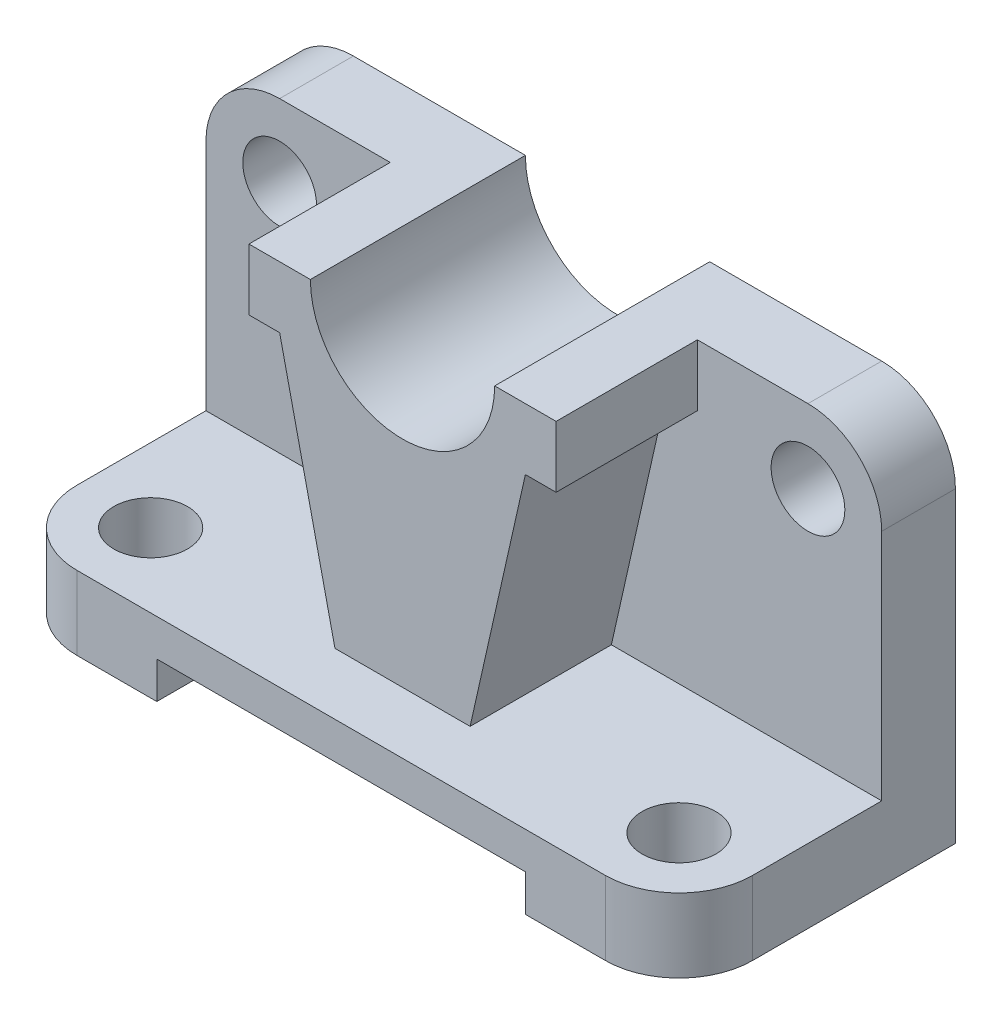
ISO-10303-21;
HEADER;
FILE_DESCRIPTION(('STEP AP214'),'2;1');
FILE_NAME('part.step','',(''),(''),'','','');
FILE_SCHEMA(('AUTOMOTIVE_DESIGN { 1 0 10303 214 1 1 1 1 }'));
ENDSEC;
DATA;
#1=APPLICATION_CONTEXT('core data for automotive mechanical design processes');
#2=APPLICATION_PROTOCOL_DEFINITION('international standard','automotive_design',2000,#1);
#3=PRODUCT_CONTEXT('',#1,'mechanical');
#4=PRODUCT('Part','Part','',(#3));
#5=PRODUCT_RELATED_PRODUCT_CATEGORY('part','',(#4));
#6=PRODUCT_DEFINITION_FORMATION('','',#4);
#7=PRODUCT_DEFINITION_CONTEXT('part definition',#1,'design');
#8=PRODUCT_DEFINITION('design','',#6,#7);
#9=PRODUCT_DEFINITION_SHAPE('','',#8);
#10=(LENGTH_UNIT() NAMED_UNIT(*) SI_UNIT(.MILLI.,.METRE.));
#11=(NAMED_UNIT(*) PLANE_ANGLE_UNIT() SI_UNIT($,.RADIAN.));
#12=(NAMED_UNIT(*) SI_UNIT($,.STERADIAN.) SOLID_ANGLE_UNIT());
#13=UNCERTAINTY_MEASURE_WITH_UNIT(LENGTH_MEASURE(1.E-05),#10,'distance_accuracy_value','');
#14=(GEOMETRIC_REPRESENTATION_CONTEXT(3) GLOBAL_UNCERTAINTY_ASSIGNED_CONTEXT((#13)) GLOBAL_UNIT_ASSIGNED_CONTEXT((#10,
#11,#12)) REPRESENTATION_CONTEXT('',''));
#15=CARTESIAN_POINT('',(0.,0.,0.));
#16=DIRECTION('',(0.,0.,1.));
#17=DIRECTION('',(1.,0.,0.));
#18=AXIS2_PLACEMENT_3D('',#15,#16,#17);
#19=CARTESIAN_POINT('',(0.,0.,45.));
#20=DIRECTION('',(0.,-1.,0.));
#21=DIRECTION('',(0.,0.,-1.));
#22=AXIS2_PLACEMENT_3D('',#19,#20,#21);
#23=PLANE('',#22);
#24=CARTESIAN_POINT('',(-43.,0.,33.));
#25=DIRECTION('',(0.,-1.,0.));
#26=DIRECTION('',(0.,0.,-1.));
#27=AXIS2_PLACEMENT_3D('',#24,#25,#26);
#28=CIRCLE('',#27,5.99999999999999);
#29=CARTESIAN_POINT('',(-43.,0.,39.));
#30=VERTEX_POINT('',#29);
#31=EDGE_CURVE('E952',#30,#30,#28,.T.);
#32=ORIENTED_EDGE('',*,*,#31,.T.);
#33=EDGE_LOOP('',(#32));
#34=FACE_BOUND('',#33,.T.);
#35=CARTESIAN_POINT('',(43.,0.,33.));
#36=DIRECTION('',(0.,-1.,0.));
#37=DIRECTION('',(0.,0.,-1.));
#38=AXIS2_PLACEMENT_3D('',#35,#36,#37);
#39=CIRCLE('',#38,5.99999999999999);
#40=CARTESIAN_POINT('',(43.,0.,39.));
#41=VERTEX_POINT('',#40);
#42=EDGE_CURVE('E491',#41,#41,#39,.T.);
#43=ORIENTED_EDGE('',*,*,#42,.T.);
#44=EDGE_LOOP('',(#43));
#45=FACE_BOUND('',#44,.T.);
#46=DIRECTION('',(-1.,0.,0.));
#47=VECTOR('',#46,1.);
#48=CARTESIAN_POINT('',(0.,0.,45.));
#49=LINE('',#48,#47);
#50=CARTESIAN_POINT('',(43.,0.,45.));
#51=VERTEX_POINT('',#50);
#52=CARTESIAN_POINT('',(-43.,0.,45.));
#53=VERTEX_POINT('',#52);
#54=EDGE_CURVE('E254',#51,#53,#49,.T.);
#55=ORIENTED_EDGE('',*,*,#54,.F.);
#56=CARTESIAN_POINT('',(43.,0.,33.));
#57=DIRECTION('',(0.,-1.,0.));
#58=DIRECTION('',(0.,0.,-1.));
#59=AXIS2_PLACEMENT_3D('',#56,#57,#58);
#60=CIRCLE('',#59,12.);
#61=CARTESIAN_POINT('',(55.,0.,33.));
#62=VERTEX_POINT('',#61);
#63=EDGE_CURVE('E337',#51,#62,#60,.F.);
#64=ORIENTED_EDGE('',*,*,#63,.T.);
#65=DIRECTION('',(0.,0.,-1.));
#66=VECTOR('',#65,1.);
#67=CARTESIAN_POINT('',(55.,0.,45.));
#68=LINE('',#67,#66);
#69=CARTESIAN_POINT('',(55.,0.,12.));
#70=VERTEX_POINT('',#69);
#71=EDGE_CURVE('E308',#62,#70,#68,.T.);
#72=ORIENTED_EDGE('',*,*,#71,.T.);
#73=DIRECTION('',(-1.,0.,0.));
#74=VECTOR('',#73,1.);
#75=CARTESIAN_POINT('',(0.,0.,12.));
#76=LINE('',#75,#74);
#77=CARTESIAN_POINT('',(11.,0.,12.));
#78=VERTEX_POINT('',#77);
#79=EDGE_CURVE('E461',#70,#78,#76,.T.);
#80=ORIENTED_EDGE('',*,*,#79,.T.);
#81=DIRECTION('',(0.,0.,-1.));
#82=VECTOR('',#81,1.);
#83=CARTESIAN_POINT('',(11.,0.,35.));
#84=LINE('',#83,#82);
#85=CARTESIAN_POINT('',(11.,0.,35.));
#86=VERTEX_POINT('',#85);
#87=EDGE_CURVE('E406',#86,#78,#84,.T.);
#88=ORIENTED_EDGE('',*,*,#87,.F.);
#89=DIRECTION('',(-1.,0.,0.));
#90=VECTOR('',#89,1.);
#91=CARTESIAN_POINT('',(0.,0.,35.));
#92=LINE('',#91,#90);
#93=CARTESIAN_POINT('',(-11.,0.,35.));
#94=VERTEX_POINT('',#93);
#95=EDGE_CURVE('E418',#86,#94,#92,.T.);
#96=ORIENTED_EDGE('',*,*,#95,.T.);
#97=DIRECTION('',(0.,0.,-1.));
#98=VECTOR('',#97,1.);
#99=CARTESIAN_POINT('',(-11.,0.,35.));
#100=LINE('',#99,#98);
#101=CARTESIAN_POINT('',(-11.,0.,12.));
#102=VERTEX_POINT('',#101);
#103=EDGE_CURVE('E238',#94,#102,#100,.T.);
#104=ORIENTED_EDGE('',*,*,#103,.T.);
#105=DIRECTION('',(-1.,0.,0.));
#106=VECTOR('',#105,1.);
#107=CARTESIAN_POINT('',(0.,0.,12.));
#108=LINE('',#107,#106);
#109=CARTESIAN_POINT('',(-55.,0.,12.));
#110=VERTEX_POINT('',#109);
#111=EDGE_CURVE('E416',#102,#110,#108,.T.);
#112=ORIENTED_EDGE('',*,*,#111,.T.);
#113=DIRECTION('',(0.,0.,-1.));
#114=VECTOR('',#113,1.);
#115=CARTESIAN_POINT('',(-55.,0.,45.));
#116=LINE('',#115,#114);
#117=CARTESIAN_POINT('',(-55.,0.,33.));
#118=VERTEX_POINT('',#117);
#119=EDGE_CURVE('E305',#118,#110,#116,.T.);
#120=ORIENTED_EDGE('',*,*,#119,.F.);
#121=CARTESIAN_POINT('',(-43.,0.,33.));
#122=DIRECTION('',(0.,-1.,0.));
#123=DIRECTION('',(0.,0.,-1.));
#124=AXIS2_PLACEMENT_3D('',#121,#122,#123);
#125=CIRCLE('',#124,12.);
#126=EDGE_CURVE('E334',#118,#53,#125,.F.);
#127=ORIENTED_EDGE('',*,*,#126,.T.);
#128=EDGE_LOOP('',(#55,#64,#72,#80,#88,#96,#104,#112,#120,#127));
#129=FACE_BOUND('',#128,.T.);
#130=ADVANCED_FACE('F43',(#34,#45,#129),#23,.F.);
#131=CARTESIAN_POINT('',(30.,0.,45.));
#132=DIRECTION('',(-1.,0.,0.));
#133=DIRECTION('',(0.,0.,1.));
#134=AXIS2_PLACEMENT_3D('',#131,#132,#133);
#135=PLANE('',#134);
#136=DIRECTION('',(0.,1.,0.));
#137=VECTOR('',#136,1.);
#138=CARTESIAN_POINT('',(30.,0.,0.));
#139=LINE('',#138,#137);
#140=CARTESIAN_POINT('',(30.,-12.,0.));
#141=VERTEX_POINT('',#140);
#142=CARTESIAN_POINT('',(30.,-5.99999999999999,0.));
#143=VERTEX_POINT('',#142);
#144=EDGE_CURVE('E245',#141,#143,#139,.T.);
#145=ORIENTED_EDGE('',*,*,#144,.F.);
#146=DIRECTION('',(0.,0.,-1.));
#147=VECTOR('',#146,1.);
#148=CARTESIAN_POINT('',(30.,-12.,45.));
#149=LINE('',#148,#147);
#150=CARTESIAN_POINT('',(30.,-12.,45.));
#151=VERTEX_POINT('',#150);
#152=EDGE_CURVE('E314',#151,#141,#149,.T.);
#153=ORIENTED_EDGE('',*,*,#152,.F.);
#154=DIRECTION('',(0.,1.,0.));
#155=VECTOR('',#154,1.);
#156=CARTESIAN_POINT('',(30.,0.,45.));
#157=LINE('',#156,#155);
#158=CARTESIAN_POINT('',(30.,-5.99999999999999,45.));
#159=VERTEX_POINT('',#158);
#160=EDGE_CURVE('E246',#151,#159,#157,.T.);
#161=ORIENTED_EDGE('',*,*,#160,.T.);
#162=DIRECTION('',(0.,0.,-1.));
#163=VECTOR('',#162,1.);
#164=CARTESIAN_POINT('',(30.,-5.99999999999999,45.));
#165=LINE('',#164,#163);
#166=EDGE_CURVE('E267',#159,#143,#165,.T.);
#167=ORIENTED_EDGE('',*,*,#166,.T.);
#168=EDGE_LOOP('',(#145,#153,#161,#167));
#169=FACE_BOUND('',#168,.T.);
#170=ADVANCED_FACE('F530',(#169),#135,.T.);
#171=CARTESIAN_POINT('',(0.,-12.,45.));
#172=DIRECTION('',(0.,-1.,0.));
#173=DIRECTION('',(1.,0.,0.));
#174=AXIS2_PLACEMENT_3D('',#171,#172,#173);
#175=PLANE('',#174);
#176=CARTESIAN_POINT('',(43.,-12.,33.));
#177=DIRECTION('',(0.,1.,0.));
#178=DIRECTION('',(0.,0.,-1.));
#179=AXIS2_PLACEMENT_3D('',#176,#177,#178);
#180=CIRCLE('',#179,5.99999999999999);
#181=CARTESIAN_POINT('',(43.,-12.,39.));
#182=VERTEX_POINT('',#181);
#183=EDGE_CURVE('E953',#182,#182,#180,.T.);
#184=ORIENTED_EDGE('',*,*,#183,.T.);
#185=EDGE_LOOP('',(#184));
#186=FACE_BOUND('',#185,.T.);
#187=DIRECTION('',(0.,0.,-1.));
#188=VECTOR('',#187,1.);
#189=CARTESIAN_POINT('',(55.,-12.,45.));
#190=LINE('',#189,#188);
#191=CARTESIAN_POINT('',(55.,-12.,33.));
#192=VERTEX_POINT('',#191);
#193=CARTESIAN_POINT('',(55.,-12.,0.));
#194=VERTEX_POINT('',#193);
#195=EDGE_CURVE('E311',#192,#194,#190,.T.);
#196=ORIENTED_EDGE('',*,*,#195,.F.);
#197=CARTESIAN_POINT('',(43.,-12.,33.));
#198=DIRECTION('',(0.,-1.,0.));
#199=DIRECTION('',(1.,0.,0.));
#200=AXIS2_PLACEMENT_3D('',#197,#198,#199);
#201=CIRCLE('',#200,12.);
#202=CARTESIAN_POINT('',(43.,-12.,45.));
#203=VERTEX_POINT('',#202);
#204=EDGE_CURVE('E324',#192,#203,#201,.T.);
#205=ORIENTED_EDGE('',*,*,#204,.T.);
#206=DIRECTION('',(-1.,0.,0.));
#207=VECTOR('',#206,1.);
#208=CARTESIAN_POINT('',(0.,-12.,45.));
#209=LINE('',#208,#207);
#210=EDGE_CURVE('E250',#203,#151,#209,.T.);
#211=ORIENTED_EDGE('',*,*,#210,.T.);
#212=ORIENTED_EDGE('',*,*,#152,.T.);
#213=DIRECTION('',(-1.,0.,0.));
#214=VECTOR('',#213,1.);
#215=CARTESIAN_POINT('',(0.,-12.,0.));
#216=LINE('',#215,#214);
#217=EDGE_CURVE('E271',#194,#141,#216,.T.);
#218=ORIENTED_EDGE('',*,*,#217,.F.);
#219=EDGE_LOOP('',(#196,#205,#211,#212,#218));
#220=FACE_BOUND('',#219,.T.);
#221=ADVANCED_FACE('F536',(#186,#220),#175,.T.);
#222=CARTESIAN_POINT('',(55.,0.,45.));
#223=DIRECTION('',(1.,0.,0.));
#224=DIRECTION('',(0.,0.,-1.));
#225=AXIS2_PLACEMENT_3D('',#222,#223,#224);
#226=PLANE('',#225);
#227=ORIENTED_EDGE('',*,*,#71,.F.);
#228=DIRECTION('',(0.,-1.,0.));
#229=VECTOR('',#228,1.);
#230=CARTESIAN_POINT('',(55.,0.,33.));
#231=LINE('',#230,#229);
#232=EDGE_CURVE('E320',#62,#192,#231,.T.);
#233=ORIENTED_EDGE('',*,*,#232,.T.);
#234=ORIENTED_EDGE('',*,*,#195,.T.);
#235=DIRECTION('',(0.,-1.,0.));
#236=VECTOR('',#235,1.);
#237=CARTESIAN_POINT('',(55.,0.,0.));
#238=LINE('',#237,#236);
#239=CARTESIAN_POINT('',(55.,38.,0.));
#240=VERTEX_POINT('',#239);
#241=EDGE_CURVE('E275',#240,#194,#238,.T.);
#242=ORIENTED_EDGE('',*,*,#241,.F.);
#243=DIRECTION('',(0.,0.,-1.));
#244=VECTOR('',#243,1.);
#245=CARTESIAN_POINT('',(55.,38.,45.));
#246=LINE('',#245,#244);
#247=CARTESIAN_POINT('',(55.,38.,12.));
#248=VERTEX_POINT('',#247);
#249=EDGE_CURVE('E317',#240,#248,#246,.F.);
#250=ORIENTED_EDGE('',*,*,#249,.T.);
#251=DIRECTION('',(0.,-1.,0.));
#252=VECTOR('',#251,1.);
#253=CARTESIAN_POINT('',(55.,0.,12.));
#254=LINE('',#253,#252);
#255=EDGE_CURVE('E455',#248,#70,#254,.T.);
#256=ORIENTED_EDGE('',*,*,#255,.T.);
#257=EDGE_LOOP('',(#227,#233,#234,#242,#250,#256));
#258=FACE_BOUND('',#257,.T.);
#259=ADVANCED_FACE('F545',(#258),#226,.T.);
#260=CARTESIAN_POINT('',(-55.,0.,45.));
#261=DIRECTION('',(1.,0.,0.));
#262=DIRECTION('',(0.,1.,0.));
#263=AXIS2_PLACEMENT_3D('',#260,#261,#262);
#264=PLANE('',#263);
#265=DIRECTION('',(0.,0.,-1.));
#266=VECTOR('',#265,1.);
#267=CARTESIAN_POINT('',(-55.,-12.,45.));
#268=LINE('',#267,#266);
#269=CARTESIAN_POINT('',(-55.,-12.,33.));
#270=VERTEX_POINT('',#269);
#271=CARTESIAN_POINT('',(-55.,-12.,0.));
#272=VERTEX_POINT('',#271);
#273=EDGE_CURVE('E301',#270,#272,#268,.T.);
#274=ORIENTED_EDGE('',*,*,#273,.F.);
#275=DIRECTION('',(0.,-1.,0.));
#276=VECTOR('',#275,1.);
#277=CARTESIAN_POINT('',(-55.,0.,33.));
#278=LINE('',#277,#276);
#279=EDGE_CURVE('E347',#270,#118,#278,.F.);
#280=ORIENTED_EDGE('',*,*,#279,.T.);
#281=ORIENTED_EDGE('',*,*,#119,.T.);
#282=DIRECTION('',(0.,1.,0.));
#283=VECTOR('',#282,1.);
#284=CARTESIAN_POINT('',(-55.,0.,12.));
#285=LINE('',#284,#283);
#286=CARTESIAN_POINT('',(-55.,38.,12.));
#287=VERTEX_POINT('',#286);
#288=EDGE_CURVE('E477',#110,#287,#285,.T.);
#289=ORIENTED_EDGE('',*,*,#288,.T.);
#290=DIRECTION('',(0.,0.,-1.));
#291=VECTOR('',#290,1.);
#292=CARTESIAN_POINT('',(-55.,38.,0.));
#293=LINE('',#292,#291);
#294=CARTESIAN_POINT('',(-55.,38.,0.));
#295=VERTEX_POINT('',#294);
#296=EDGE_CURVE('E343',#287,#295,#293,.T.);
#297=ORIENTED_EDGE('',*,*,#296,.T.);
#298=DIRECTION('',(0.,-1.,0.));
#299=VECTOR('',#298,1.);
#300=CARTESIAN_POINT('',(-55.,0.,0.));
#301=LINE('',#300,#299);
#302=EDGE_CURVE('E279',#295,#272,#301,.T.);
#303=ORIENTED_EDGE('',*,*,#302,.T.);
#304=EDGE_LOOP('',(#274,#280,#281,#289,#297,#303));
#305=FACE_BOUND('',#304,.T.);
#306=ADVANCED_FACE('F543',(#305),#264,.F.);
#307=CARTESIAN_POINT('',(0.,-12.,45.));
#308=DIRECTION('',(0.,1.,0.));
#309=DIRECTION('',(-1.,0.,0.));
#310=AXIS2_PLACEMENT_3D('',#307,#308,#309);
#311=PLANE('',#310);
#312=CARTESIAN_POINT('',(-43.,-12.,33.));
#313=DIRECTION('',(0.,1.,0.));
#314=DIRECTION('',(0.,0.,1.));
#315=AXIS2_PLACEMENT_3D('',#312,#313,#314);
#316=CIRCLE('',#315,5.99999999999999);
#317=CARTESIAN_POINT('',(-43.,-12.,39.));
#318=VERTEX_POINT('',#317);
#319=EDGE_CURVE('E950',#318,#318,#316,.T.);
#320=ORIENTED_EDGE('',*,*,#319,.T.);
#321=EDGE_LOOP('',(#320));
#322=FACE_BOUND('',#321,.T.);
#323=DIRECTION('',(1.,0.,0.));
#324=VECTOR('',#323,1.);
#325=CARTESIAN_POINT('',(0.,-12.,45.));
#326=LINE('',#325,#324);
#327=CARTESIAN_POINT('',(-43.,-12.,45.));
#328=VERTEX_POINT('',#327);
#329=CARTESIAN_POINT('',(-30.,-12.,45.));
#330=VERTEX_POINT('',#329);
#331=EDGE_CURVE('E258',#328,#330,#326,.T.);
#332=ORIENTED_EDGE('',*,*,#331,.F.);
#333=CARTESIAN_POINT('',(-43.,-12.,33.));
#334=DIRECTION('',(0.,1.,0.));
#335=DIRECTION('',(-1.,0.,0.));
#336=AXIS2_PLACEMENT_3D('',#333,#334,#335);
#337=CIRCLE('',#336,12.);
#338=EDGE_CURVE('E340',#328,#270,#337,.F.);
#339=ORIENTED_EDGE('',*,*,#338,.T.);
#340=ORIENTED_EDGE('',*,*,#273,.T.);
#341=DIRECTION('',(1.,0.,0.));
#342=VECTOR('',#341,1.);
#343=CARTESIAN_POINT('',(0.,-12.,0.));
#344=LINE('',#343,#342);
#345=CARTESIAN_POINT('',(-30.,-12.,0.));
#346=VERTEX_POINT('',#345);
#347=EDGE_CURVE('E282',#272,#346,#344,.T.);
#348=ORIENTED_EDGE('',*,*,#347,.T.);
#349=DIRECTION('',(0.,0.,-1.));
#350=VECTOR('',#349,1.);
#351=CARTESIAN_POINT('',(-30.,-12.,45.));
#352=LINE('',#351,#350);
#353=EDGE_CURVE('E297',#330,#346,#352,.T.);
#354=ORIENTED_EDGE('',*,*,#353,.F.);
#355=EDGE_LOOP('',(#332,#339,#340,#348,#354));
#356=FACE_BOUND('',#355,.T.);
#357=ADVANCED_FACE('F578',(#322,#356),#311,.F.);
#358=CARTESIAN_POINT('',(-30.,0.,45.));
#359=DIRECTION('',(-1.,0.,0.));
#360=DIRECTION('',(0.,0.,1.));
#361=AXIS2_PLACEMENT_3D('',#358,#359,#360);
#362=PLANE('',#361);
#363=DIRECTION('',(0.,1.,0.));
#364=VECTOR('',#363,1.);
#365=CARTESIAN_POINT('',(-30.,0.,0.));
#366=LINE('',#365,#364);
#367=CARTESIAN_POINT('',(-30.,-6.,0.));
#368=VERTEX_POINT('',#367);
#369=EDGE_CURVE('E285',#346,#368,#366,.T.);
#370=ORIENTED_EDGE('',*,*,#369,.T.);
#371=DIRECTION('',(0.,0.,-1.));
#372=VECTOR('',#371,1.);
#373=CARTESIAN_POINT('',(-30.,-6.,45.));
#374=LINE('',#373,#372);
#375=CARTESIAN_POINT('',(-30.,-6.,45.));
#376=VERTEX_POINT('',#375);
#377=EDGE_CURVE('E293',#376,#368,#374,.T.);
#378=ORIENTED_EDGE('',*,*,#377,.F.);
#379=DIRECTION('',(0.,1.,0.));
#380=VECTOR('',#379,1.);
#381=CARTESIAN_POINT('',(-30.,0.,45.));
#382=LINE('',#381,#380);
#383=EDGE_CURVE('E261',#330,#376,#382,.T.);
#384=ORIENTED_EDGE('',*,*,#383,.F.);
#385=ORIENTED_EDGE('',*,*,#353,.T.);
#386=EDGE_LOOP('',(#370,#378,#384,#385));
#387=FACE_BOUND('',#386,.T.);
#388=ADVANCED_FACE('F584',(#387),#362,.F.);
#389=CARTESIAN_POINT('',(0.,-5.99999999999999,45.));
#390=DIRECTION('',(0.,1.,0.));
#391=DIRECTION('',(-1.,0.,0.));
#392=AXIS2_PLACEMENT_3D('',#389,#390,#391);
#393=PLANE('',#392);
#394=DIRECTION('',(1.,0.,0.));
#395=VECTOR('',#394,1.);
#396=CARTESIAN_POINT('',(0.,-5.99999999999999,0.));
#397=LINE('',#396,#395);
#398=EDGE_CURVE('E251',#368,#143,#397,.T.);
#399=ORIENTED_EDGE('',*,*,#398,.T.);
#400=ORIENTED_EDGE('',*,*,#166,.F.);
#401=DIRECTION('',(1.,0.,0.));
#402=VECTOR('',#401,1.);
#403=CARTESIAN_POINT('',(0.,-5.99999999999999,45.));
#404=LINE('',#403,#402);
#405=EDGE_CURVE('E264',#376,#159,#404,.T.);
#406=ORIENTED_EDGE('',*,*,#405,.F.);
#407=ORIENTED_EDGE('',*,*,#377,.T.);
#408=EDGE_LOOP('',(#399,#400,#406,#407));
#409=FACE_BOUND('',#408,.T.);
#410=ADVANCED_FACE('F589',(#409),#393,.F.);
#411=CARTESIAN_POINT('',(0.,0.,45.));
#412=DIRECTION('',(0.,0.,1.));
#413=DIRECTION('',(1.,0.,0.));
#414=AXIS2_PLACEMENT_3D('',#411,#412,#413);
#415=PLANE('',#414);
#416=ORIENTED_EDGE('',*,*,#210,.F.);
#417=DIRECTION('',(0.,-1.,0.));
#418=VECTOR('',#417,1.);
#419=CARTESIAN_POINT('',(43.,0.,45.));
#420=LINE('',#419,#418);
#421=EDGE_CURVE('E331',#203,#51,#420,.F.);
#422=ORIENTED_EDGE('',*,*,#421,.T.);
#423=ORIENTED_EDGE('',*,*,#54,.T.);
#424=DIRECTION('',(0.,-1.,0.));
#425=VECTOR('',#424,1.);
#426=CARTESIAN_POINT('',(-43.,-12.,45.));
#427=LINE('',#426,#425);
#428=EDGE_CURVE('E327',#53,#328,#427,.T.);
#429=ORIENTED_EDGE('',*,*,#428,.T.);
#430=ORIENTED_EDGE('',*,*,#331,.T.);
#431=ORIENTED_EDGE('',*,*,#383,.T.);
#432=ORIENTED_EDGE('',*,*,#405,.T.);
#433=ORIENTED_EDGE('',*,*,#160,.F.);
#434=EDGE_LOOP('',(#416,#422,#423,#429,#430,#431,#432,#433));
#435=FACE_BOUND('',#434,.T.);
#436=ADVANCED_FACE('F526',(#435),#415,.T.);
#437=CARTESIAN_POINT('',(0.,0.,0.));
#438=DIRECTION('',(0.,0.,1.));
#439=DIRECTION('',(1.,0.,0.));
#440=AXIS2_PLACEMENT_3D('',#437,#438,#439);
#441=PLANE('',#440);
#442=ORIENTED_EDGE('',*,*,#302,.F.);
#443=CARTESIAN_POINT('',(-43.,38.,0.));
#444=DIRECTION('',(0.,0.,1.));
#445=DIRECTION('',(1.,0.,0.));
#446=AXIS2_PLACEMENT_3D('',#443,#444,#445);
#447=CIRCLE('',#446,12.);
#448=CARTESIAN_POINT('',(-43.,50.,0.));
#449=VERTEX_POINT('',#448);
#450=EDGE_CURVE('E353',#295,#449,#447,.F.);
#451=ORIENTED_EDGE('',*,*,#450,.T.);
#452=DIRECTION('',(1.,0.,0.));
#453=VECTOR('',#452,1.);
#454=CARTESIAN_POINT('',(0.,50.,0.));
#455=LINE('',#454,#453);
#456=CARTESIAN_POINT('',(-15.,50.,0.));
#457=VERTEX_POINT('',#456);
#458=EDGE_CURVE('E381',#449,#457,#455,.T.);
#459=ORIENTED_EDGE('',*,*,#458,.T.);
#460=CARTESIAN_POINT('',(0.,50.,0.));
#461=DIRECTION('',(0.,0.,1.));
#462=DIRECTION('',(1.,0.,0.));
#463=AXIS2_PLACEMENT_3D('',#460,#461,#462);
#464=CIRCLE('',#463,15.);
#465=CARTESIAN_POINT('',(15.,50.,0.));
#466=VERTEX_POINT('',#465);
#467=EDGE_CURVE('E378',#457,#466,#464,.T.);
#468=ORIENTED_EDGE('',*,*,#467,.T.);
#469=DIRECTION('',(1.,0.,0.));
#470=VECTOR('',#469,1.);
#471=CARTESIAN_POINT('',(0.,50.,0.));
#472=LINE('',#471,#470);
#473=CARTESIAN_POINT('',(43.,50.,0.));
#474=VERTEX_POINT('',#473);
#475=EDGE_CURVE('E367',#466,#474,#472,.T.);
#476=ORIENTED_EDGE('',*,*,#475,.T.);
#477=CARTESIAN_POINT('',(43.,38.,0.));
#478=DIRECTION('',(0.,0.,1.));
#479=DIRECTION('',(1.,0.,0.));
#480=AXIS2_PLACEMENT_3D('',#477,#478,#479);
#481=CIRCLE('',#480,12.);
#482=EDGE_CURVE('E350',#474,#240,#481,.F.);
#483=ORIENTED_EDGE('',*,*,#482,.T.);
#484=ORIENTED_EDGE('',*,*,#241,.T.);
#485=ORIENTED_EDGE('',*,*,#217,.T.);
#486=ORIENTED_EDGE('',*,*,#144,.T.);
#487=ORIENTED_EDGE('',*,*,#398,.F.);
#488=ORIENTED_EDGE('',*,*,#369,.F.);
#489=ORIENTED_EDGE('',*,*,#347,.F.);
#490=EDGE_LOOP('',(#442,#451,#459,#468,#476,#483,#484,#485,#486,#487,#488,#489));
#491=FACE_BOUND('',#490,.T.);
#492=CARTESIAN_POINT('',(43.,38.,0.));
#493=DIRECTION('',(0.,0.,1.));
#494=DIRECTION('',(1.,0.,0.));
#495=AXIS2_PLACEMENT_3D('',#492,#493,#494);
#496=CIRCLE('',#495,6.);
#497=CARTESIAN_POINT('',(49.,38.,0.));
#498=VERTEX_POINT('',#497);
#499=EDGE_CURVE('E465',#498,#498,#496,.F.);
#500=ORIENTED_EDGE('',*,*,#499,.F.);
#501=EDGE_LOOP('',(#500));
#502=FACE_BOUND('',#501,.T.);
#503=CARTESIAN_POINT('',(-43.,38.,0.));
#504=DIRECTION('',(0.,0.,1.));
#505=DIRECTION('',(1.,0.,0.));
#506=AXIS2_PLACEMENT_3D('',#503,#504,#505);
#507=CIRCLE('',#506,6.);
#508=CARTESIAN_POINT('',(-37.,38.,0.));
#509=VERTEX_POINT('',#508);
#510=EDGE_CURVE('E487',#509,#509,#507,.T.);
#511=ORIENTED_EDGE('',*,*,#510,.T.);
#512=EDGE_LOOP('',(#511));
#513=FACE_BOUND('',#512,.T.);
#514=ADVANCED_FACE('F374',(#491,#502,#513),#441,.F.);
#515=CARTESIAN_POINT('',(0.,50.,35.));
#516=DIRECTION('',(0.,0.,-1.));
#517=DIRECTION('',(-1.,0.,0.));
#518=AXIS2_PLACEMENT_3D('',#515,#516,#517);
#519=CYLINDRICAL_SURFACE('',#518,15.);
#520=ORIENTED_EDGE('',*,*,#467,.F.);
#521=DIRECTION('',(0.,0.,-1.));
#522=VECTOR('',#521,1.);
#523=CARTESIAN_POINT('',(-15.,50.,35.));
#524=LINE('',#523,#522);
#525=CARTESIAN_POINT('',(-15.,50.,35.));
#526=VERTEX_POINT('',#525);
#527=EDGE_CURVE('E236',#526,#457,#524,.T.);
#528=ORIENTED_EDGE('',*,*,#527,.F.);
#529=CARTESIAN_POINT('',(0.,50.,35.));
#530=DIRECTION('',(0.,0.,1.));
#531=DIRECTION('',(1.,0.,0.));
#532=AXIS2_PLACEMENT_3D('',#529,#530,#531);
#533=CIRCLE('',#532,15.);
#534=CARTESIAN_POINT('',(15.,50.,35.));
#535=VERTEX_POINT('',#534);
#536=EDGE_CURVE('E380',#526,#535,#533,.T.);
#537=ORIENTED_EDGE('',*,*,#536,.T.);
#538=DIRECTION('',(0.,0.,-1.));
#539=VECTOR('',#538,1.);
#540=CARTESIAN_POINT('',(15.,50.,35.));
#541=LINE('',#540,#539);
#542=EDGE_CURVE('E391',#535,#466,#541,.T.);
#543=ORIENTED_EDGE('',*,*,#542,.T.);
#544=EDGE_LOOP('',(#520,#528,#537,#543));
#545=FACE_BOUND('',#544,.T.);
#546=ADVANCED_FACE('F518',(#545),#519,.F.);
#547=CARTESIAN_POINT('',(0.,50.,35.));
#548=DIRECTION('',(0.,1.,0.));
#549=DIRECTION('',(-1.,0.,0.));
#550=AXIS2_PLACEMENT_3D('',#547,#548,#549);
#551=PLANE('',#550);
#552=ORIENTED_EDGE('',*,*,#458,.F.);
#553=DIRECTION('',(0.,0.,-1.));
#554=VECTOR('',#553,1.);
#555=CARTESIAN_POINT('',(-43.,50.,12.));
#556=LINE('',#555,#554);
#557=CARTESIAN_POINT('',(-43.,50.,12.));
#558=VERTEX_POINT('',#557);
#559=EDGE_CURVE('E65',#449,#558,#556,.F.);
#560=ORIENTED_EDGE('',*,*,#559,.T.);
#561=DIRECTION('',(1.,0.,0.));
#562=VECTOR('',#561,1.);
#563=CARTESIAN_POINT('',(0.,50.,12.));
#564=LINE('',#563,#562);
#565=CARTESIAN_POINT('',(-25.,50.,12.));
#566=VERTEX_POINT('',#565);
#567=EDGE_CURVE('E225',#558,#566,#564,.T.);
#568=ORIENTED_EDGE('',*,*,#567,.T.);
#569=DIRECTION('',(0.,0.,-1.));
#570=VECTOR('',#569,1.);
#571=CARTESIAN_POINT('',(-25.,50.,35.));
#572=LINE('',#571,#570);
#573=CARTESIAN_POINT('',(-25.,50.,35.));
#574=VERTEX_POINT('',#573);
#575=EDGE_CURVE('E223',#574,#566,#572,.T.);
#576=ORIENTED_EDGE('',*,*,#575,.F.);
#577=DIRECTION('',(1.,0.,0.));
#578=VECTOR('',#577,1.);
#579=CARTESIAN_POINT('',(0.,50.,35.));
#580=LINE('',#579,#578);
#581=EDGE_CURVE('E386',#574,#526,#580,.T.);
#582=ORIENTED_EDGE('',*,*,#581,.T.);
#583=ORIENTED_EDGE('',*,*,#527,.T.);
#584=EDGE_LOOP('',(#552,#560,#568,#576,#582,#583));
#585=FACE_BOUND('',#584,.T.);
#586=ADVANCED_FACE('F474',(#585),#551,.T.);
#587=CARTESIAN_POINT('',(-25.,0.,35.));
#588=DIRECTION('',(-1.,0.,0.));
#589=DIRECTION('',(0.,0.,1.));
#590=AXIS2_PLACEMENT_3D('',#587,#588,#589);
#591=PLANE('',#590);
#592=DIRECTION('',(0.,1.,0.));
#593=VECTOR('',#592,1.);
#594=CARTESIAN_POINT('',(-25.,0.,12.));
#595=LINE('',#594,#593);
#596=CARTESIAN_POINT('',(-25.,40.,12.));
#597=VERTEX_POINT('',#596);
#598=EDGE_CURVE('E208',#597,#566,#595,.T.);
#599=ORIENTED_EDGE('',*,*,#598,.F.);
#600=DIRECTION('',(0.,0.,-1.));
#601=VECTOR('',#600,1.);
#602=CARTESIAN_POINT('',(-25.,40.,35.));
#603=LINE('',#602,#601);
#604=CARTESIAN_POINT('',(-25.,40.,35.));
#605=VERTEX_POINT('',#604);
#606=EDGE_CURVE('E221',#605,#597,#603,.T.);
#607=ORIENTED_EDGE('',*,*,#606,.F.);
#608=DIRECTION('',(0.,1.,0.));
#609=VECTOR('',#608,1.);
#610=CARTESIAN_POINT('',(-25.,0.,35.));
#611=LINE('',#610,#609);
#612=EDGE_CURVE('E435',#605,#574,#611,.T.);
#613=ORIENTED_EDGE('',*,*,#612,.T.);
#614=ORIENTED_EDGE('',*,*,#575,.T.);
#615=EDGE_LOOP('',(#599,#607,#613,#614));
#616=FACE_BOUND('',#615,.T.);
#617=ADVANCED_FACE('F219',(#616),#591,.T.);
#618=CARTESIAN_POINT('',(0.,40.,35.));
#619=DIRECTION('',(0.,-1.,0.));
#620=DIRECTION('',(0.,0.,-1.));
#621=AXIS2_PLACEMENT_3D('',#618,#619,#620);
#622=PLANE('',#621);
#623=DIRECTION('',(-1.,0.,0.));
#624=VECTOR('',#623,1.);
#625=CARTESIAN_POINT('',(0.,40.,12.));
#626=LINE('',#625,#624);
#627=CARTESIAN_POINT('',(-20.,40.,12.));
#628=VERTEX_POINT('',#627);
#629=EDGE_CURVE('E205',#628,#597,#626,.T.);
#630=ORIENTED_EDGE('',*,*,#629,.F.);
#631=DIRECTION('',(0.,0.,-1.));
#632=VECTOR('',#631,1.);
#633=CARTESIAN_POINT('',(-20.,40.,35.));
#634=LINE('',#633,#632);
#635=CARTESIAN_POINT('',(-20.,40.,35.));
#636=VERTEX_POINT('',#635);
#637=EDGE_CURVE('E232',#636,#628,#634,.T.);
#638=ORIENTED_EDGE('',*,*,#637,.F.);
#639=DIRECTION('',(-1.,0.,0.));
#640=VECTOR('',#639,1.);
#641=CARTESIAN_POINT('',(0.,40.,35.));
#642=LINE('',#641,#640);
#643=EDGE_CURVE('E230',#636,#605,#642,.T.);
#644=ORIENTED_EDGE('',*,*,#643,.T.);
#645=ORIENTED_EDGE('',*,*,#606,.T.);
#646=EDGE_LOOP('',(#630,#638,#644,#645));
#647=FACE_BOUND('',#646,.T.);
#648=ADVANCED_FACE('F228',(#647),#622,.T.);
#649=CARTESIAN_POINT('',(-10.4699583581202,-2.35574063057704,35.));
#650=DIRECTION('',(-0.975609756097561,-0.219512195121951,0.));
#651=DIRECTION('',(0.219512195121951,-0.975609756097561,0.));
#652=AXIS2_PLACEMENT_3D('',#649,#650,#651);
#653=PLANE('',#652);
#654=DIRECTION('',(-0.219512195121951,0.975609756097561,0.));
#655=VECTOR('',#654,1.);
#656=CARTESIAN_POINT('',(-10.4699583581202,-2.35574063057704,12.));
#657=LINE('',#656,#655);
#658=EDGE_CURVE('E211',#102,#628,#657,.T.);
#659=ORIENTED_EDGE('',*,*,#658,.F.);
#660=ORIENTED_EDGE('',*,*,#103,.F.);
#661=DIRECTION('',(-0.219512195121951,0.975609756097561,0.));
#662=VECTOR('',#661,1.);
#663=CARTESIAN_POINT('',(-10.4699583581202,-2.35574063057704,35.));
#664=LINE('',#663,#662);
#665=EDGE_CURVE('E423',#94,#636,#664,.T.);
#666=ORIENTED_EDGE('',*,*,#665,.T.);
#667=ORIENTED_EDGE('',*,*,#637,.T.);
#668=EDGE_LOOP('',(#659,#660,#666,#667));
#669=FACE_BOUND('',#668,.T.);
#670=ADVANCED_FACE('F422',(#669),#653,.T.);
#671=CARTESIAN_POINT('',(10.4699583581202,-2.35574063057704,35.));
#672=DIRECTION('',(0.975609756097561,-0.219512195121951,0.));
#673=DIRECTION('',(0.219512195121951,0.975609756097561,0.));
#674=AXIS2_PLACEMENT_3D('',#671,#672,#673);
#675=PLANE('',#674);
#676=DIRECTION('',(-0.219512195121951,-0.975609756097561,0.));
#677=VECTOR('',#676,1.);
#678=CARTESIAN_POINT('',(10.4699583581202,-2.35574063057704,12.));
#679=LINE('',#678,#677);
#680=CARTESIAN_POINT('',(20.,40.,12.));
#681=VERTEX_POINT('',#680);
#682=EDGE_CURVE('E500',#681,#78,#679,.T.);
#683=ORIENTED_EDGE('',*,*,#682,.F.);
#684=DIRECTION('',(0.,0.,-1.));
#685=VECTOR('',#684,1.);
#686=CARTESIAN_POINT('',(20.,40.,35.));
#687=LINE('',#686,#685);
#688=CARTESIAN_POINT('',(20.,40.,35.));
#689=VERTEX_POINT('',#688);
#690=EDGE_CURVE('E402',#689,#681,#687,.T.);
#691=ORIENTED_EDGE('',*,*,#690,.F.);
#692=DIRECTION('',(-0.219512195121951,-0.975609756097561,0.));
#693=VECTOR('',#692,1.);
#694=CARTESIAN_POINT('',(10.4699583581202,-2.35574063057704,35.));
#695=LINE('',#694,#693);
#696=EDGE_CURVE('E433',#689,#86,#695,.T.);
#697=ORIENTED_EDGE('',*,*,#696,.T.);
#698=ORIENTED_EDGE('',*,*,#87,.T.);
#699=EDGE_LOOP('',(#683,#691,#697,#698));
#700=FACE_BOUND('',#699,.T.);
#701=ADVANCED_FACE('F508',(#700),#675,.T.);
#702=CARTESIAN_POINT('',(0.,40.,35.));
#703=DIRECTION('',(0.,-1.,0.));
#704=DIRECTION('',(0.,0.,-1.));
#705=AXIS2_PLACEMENT_3D('',#702,#703,#704);
#706=PLANE('',#705);
#707=DIRECTION('',(-1.,0.,0.));
#708=VECTOR('',#707,1.);
#709=CARTESIAN_POINT('',(0.,40.,12.));
#710=LINE('',#709,#708);
#711=CARTESIAN_POINT('',(25.,40.,12.));
#712=VERTEX_POINT('',#711);
#713=EDGE_CURVE('E497',#712,#681,#710,.T.);
#714=ORIENTED_EDGE('',*,*,#713,.F.);
#715=DIRECTION('',(0.,0.,-1.));
#716=VECTOR('',#715,1.);
#717=CARTESIAN_POINT('',(25.,40.,35.));
#718=LINE('',#717,#716);
#719=CARTESIAN_POINT('',(25.,40.,35.));
#720=VERTEX_POINT('',#719);
#721=EDGE_CURVE('E398',#720,#712,#718,.T.);
#722=ORIENTED_EDGE('',*,*,#721,.F.);
#723=DIRECTION('',(-1.,0.,0.));
#724=VECTOR('',#723,1.);
#725=CARTESIAN_POINT('',(0.,40.,35.));
#726=LINE('',#725,#724);
#727=EDGE_CURVE('E441',#720,#689,#726,.T.);
#728=ORIENTED_EDGE('',*,*,#727,.T.);
#729=ORIENTED_EDGE('',*,*,#690,.T.);
#730=EDGE_LOOP('',(#714,#722,#728,#729));
#731=FACE_BOUND('',#730,.T.);
#732=ADVANCED_FACE('F513',(#731),#706,.T.);
#733=CARTESIAN_POINT('',(25.,0.,35.));
#734=DIRECTION('',(1.,0.,0.));
#735=DIRECTION('',(0.,0.,-1.));
#736=AXIS2_PLACEMENT_3D('',#733,#734,#735);
#737=PLANE('',#736);
#738=DIRECTION('',(0.,-1.,0.));
#739=VECTOR('',#738,1.);
#740=CARTESIAN_POINT('',(25.,0.,12.));
#741=LINE('',#740,#739);
#742=CARTESIAN_POINT('',(25.,50.,12.));
#743=VERTEX_POINT('',#742);
#744=EDGE_CURVE('E494',#743,#712,#741,.T.);
#745=ORIENTED_EDGE('',*,*,#744,.F.);
#746=DIRECTION('',(0.,0.,-1.));
#747=VECTOR('',#746,1.);
#748=CARTESIAN_POINT('',(25.,50.,35.));
#749=LINE('',#748,#747);
#750=CARTESIAN_POINT('',(25.,50.,35.));
#751=VERTEX_POINT('',#750);
#752=EDGE_CURVE('E394',#751,#743,#749,.T.);
#753=ORIENTED_EDGE('',*,*,#752,.F.);
#754=DIRECTION('',(0.,-1.,0.));
#755=VECTOR('',#754,1.);
#756=CARTESIAN_POINT('',(25.,0.,35.));
#757=LINE('',#756,#755);
#758=EDGE_CURVE('E445',#751,#720,#757,.T.);
#759=ORIENTED_EDGE('',*,*,#758,.T.);
#760=ORIENTED_EDGE('',*,*,#721,.T.);
#761=EDGE_LOOP('',(#745,#753,#759,#760));
#762=FACE_BOUND('',#761,.T.);
#763=ADVANCED_FACE('F516',(#762),#737,.T.);
#764=CARTESIAN_POINT('',(0.,50.,35.));
#765=DIRECTION('',(0.,1.,0.));
#766=DIRECTION('',(0.,0.,1.));
#767=AXIS2_PLACEMENT_3D('',#764,#765,#766);
#768=PLANE('',#767);
#769=DIRECTION('',(1.,0.,0.));
#770=VECTOR('',#769,1.);
#771=CARTESIAN_POINT('',(0.,50.,12.));
#772=LINE('',#771,#770);
#773=CARTESIAN_POINT('',(43.,50.,12.));
#774=VERTEX_POINT('',#773);
#775=EDGE_CURVE('E369',#743,#774,#772,.T.);
#776=ORIENTED_EDGE('',*,*,#775,.T.);
#777=DIRECTION('',(0.,0.,-1.));
#778=VECTOR('',#777,1.);
#779=CARTESIAN_POINT('',(43.,50.,35.));
#780=LINE('',#779,#778);
#781=EDGE_CURVE('E52',#774,#474,#780,.T.);
#782=ORIENTED_EDGE('',*,*,#781,.T.);
#783=ORIENTED_EDGE('',*,*,#475,.F.);
#784=ORIENTED_EDGE('',*,*,#542,.F.);
#785=DIRECTION('',(1.,0.,0.));
#786=VECTOR('',#785,1.);
#787=CARTESIAN_POINT('',(0.,50.,35.));
#788=LINE('',#787,#786);
#789=EDGE_CURVE('E395',#535,#751,#788,.T.);
#790=ORIENTED_EDGE('',*,*,#789,.T.);
#791=ORIENTED_EDGE('',*,*,#752,.T.);
#792=EDGE_LOOP('',(#776,#782,#783,#784,#790,#791));
#793=FACE_BOUND('',#792,.T.);
#794=ADVANCED_FACE('F366',(#793),#768,.T.);
#795=CARTESIAN_POINT('',(0.,0.,35.));
#796=DIRECTION('',(0.,0.,1.));
#797=DIRECTION('',(1.,0.,0.));
#798=AXIS2_PLACEMENT_3D('',#795,#796,#797);
#799=PLANE('',#798);
#800=ORIENTED_EDGE('',*,*,#536,.F.);
#801=ORIENTED_EDGE('',*,*,#581,.F.);
#802=ORIENTED_EDGE('',*,*,#612,.F.);
#803=ORIENTED_EDGE('',*,*,#643,.F.);
#804=ORIENTED_EDGE('',*,*,#665,.F.);
#805=ORIENTED_EDGE('',*,*,#95,.F.);
#806=ORIENTED_EDGE('',*,*,#696,.F.);
#807=ORIENTED_EDGE('',*,*,#727,.F.);
#808=ORIENTED_EDGE('',*,*,#758,.F.);
#809=ORIENTED_EDGE('',*,*,#789,.F.);
#810=EDGE_LOOP('',(#800,#801,#802,#803,#804,#805,#806,#807,#808,#809));
#811=FACE_BOUND('',#810,.T.);
#812=ADVANCED_FACE('F426',(#811),#799,.T.);
#813=CARTESIAN_POINT('',(43.,38.,12.));
#814=DIRECTION('',(0.,0.,-1.));
#815=DIRECTION('',(-1.,0.,0.));
#816=AXIS2_PLACEMENT_3D('',#813,#814,#815);
#817=CYLINDRICAL_SURFACE('',#816,6.);
#818=CARTESIAN_POINT('',(43.,38.,12.));
#819=DIRECTION('',(0.,0.,1.));
#820=DIRECTION('',(1.,0.,0.));
#821=AXIS2_PLACEMENT_3D('',#818,#819,#820);
#822=CIRCLE('',#821,6.);
#823=CARTESIAN_POINT('',(49.,38.,12.));
#824=VERTEX_POINT('',#823);
#825=EDGE_CURVE('E452',#824,#824,#822,.F.);
#826=ORIENTED_EDGE('',*,*,#825,.F.);
#827=EDGE_LOOP('',(#826));
#828=FACE_BOUND('',#827,.T.);
#829=ORIENTED_EDGE('',*,*,#499,.T.);
#830=EDGE_LOOP('',(#829));
#831=FACE_BOUND('',#830,.T.);
#832=ADVANCED_FACE('F603',(#828,#831),#817,.F.);
#833=CARTESIAN_POINT('',(0.,0.,12.));
#834=DIRECTION('',(0.,0.,1.));
#835=DIRECTION('',(1.,0.,0.));
#836=AXIS2_PLACEMENT_3D('',#833,#834,#835);
#837=PLANE('',#836);
#838=ORIENTED_EDGE('',*,*,#255,.F.);
#839=CARTESIAN_POINT('',(43.,38.,12.));
#840=DIRECTION('',(0.,0.,1.));
#841=DIRECTION('',(1.,0.,0.));
#842=AXIS2_PLACEMENT_3D('',#839,#840,#841);
#843=CIRCLE('',#842,12.);
#844=EDGE_CURVE('E11',#248,#774,#843,.T.);
#845=ORIENTED_EDGE('',*,*,#844,.T.);
#846=ORIENTED_EDGE('',*,*,#775,.F.);
#847=ORIENTED_EDGE('',*,*,#744,.T.);
#848=ORIENTED_EDGE('',*,*,#713,.T.);
#849=ORIENTED_EDGE('',*,*,#682,.T.);
#850=ORIENTED_EDGE('',*,*,#79,.F.);
#851=EDGE_LOOP('',(#838,#845,#846,#847,#848,#849,#850));
#852=FACE_BOUND('',#851,.T.);
#853=ORIENTED_EDGE('',*,*,#825,.T.);
#854=EDGE_LOOP('',(#853));
#855=FACE_BOUND('',#854,.T.);
#856=ADVANCED_FACE('F600',(#852,#855),#837,.T.);
#857=CARTESIAN_POINT('',(-43.,38.,12.));
#858=DIRECTION('',(0.,0.,-1.));
#859=DIRECTION('',(-1.,0.,0.));
#860=AXIS2_PLACEMENT_3D('',#857,#858,#859);
#861=CYLINDRICAL_SURFACE('',#860,6.);
#862=CARTESIAN_POINT('',(-43.,38.,12.));
#863=DIRECTION('',(0.,0.,1.));
#864=DIRECTION('',(1.,0.,0.));
#865=AXIS2_PLACEMENT_3D('',#862,#863,#864);
#866=CIRCLE('',#865,6.);
#867=CARTESIAN_POINT('',(-37.,38.,12.));
#868=VERTEX_POINT('',#867);
#869=EDGE_CURVE('E216',#868,#868,#866,.T.);
#870=ORIENTED_EDGE('',*,*,#869,.T.);
#871=EDGE_LOOP('',(#870));
#872=FACE_BOUND('',#871,.T.);
#873=ORIENTED_EDGE('',*,*,#510,.F.);
#874=EDGE_LOOP('',(#873));
#875=FACE_BOUND('',#874,.T.);
#876=ADVANCED_FACE('F602',(#872,#875),#861,.F.);
#877=CARTESIAN_POINT('',(0.,0.,12.));
#878=DIRECTION('',(0.,0.,1.));
#879=DIRECTION('',(1.,0.,0.));
#880=AXIS2_PLACEMENT_3D('',#877,#878,#879);
#881=PLANE('',#880);
#882=ORIENTED_EDGE('',*,*,#869,.F.);
#883=EDGE_LOOP('',(#882));
#884=FACE_BOUND('',#883,.T.);
#885=ORIENTED_EDGE('',*,*,#567,.F.);
#886=CARTESIAN_POINT('',(-43.,38.,12.));
#887=DIRECTION('',(0.,0.,1.));
#888=DIRECTION('',(1.,0.,0.));
#889=AXIS2_PLACEMENT_3D('',#886,#887,#888);
#890=CIRCLE('',#889,12.);
#891=EDGE_CURVE('E358',#558,#287,#890,.T.);
#892=ORIENTED_EDGE('',*,*,#891,.T.);
#893=ORIENTED_EDGE('',*,*,#288,.F.);
#894=ORIENTED_EDGE('',*,*,#111,.F.);
#895=ORIENTED_EDGE('',*,*,#658,.T.);
#896=ORIENTED_EDGE('',*,*,#629,.T.);
#897=ORIENTED_EDGE('',*,*,#598,.T.);
#898=EDGE_LOOP('',(#885,#892,#893,#894,#895,#896,#897));
#899=FACE_BOUND('',#898,.T.);
#900=ADVANCED_FACE('F207',(#884,#899),#881,.T.);
#901=CARTESIAN_POINT('',(43.,0.,33.));
#902=DIRECTION('',(0.,-1.,0.));
#903=DIRECTION('',(0.,0.,-1.));
#904=AXIS2_PLACEMENT_3D('',#901,#902,#903);
#905=CYLINDRICAL_SURFACE('',#904,12.);
#906=ORIENTED_EDGE('',*,*,#63,.F.);
#907=ORIENTED_EDGE('',*,*,#421,.F.);
#908=ORIENTED_EDGE('',*,*,#204,.F.);
#909=ORIENTED_EDGE('',*,*,#232,.F.);
#910=EDGE_LOOP('',(#906,#907,#908,#909));
#911=FACE_BOUND('',#910,.T.);
#912=ADVANCED_FACE('F552',(#911),#905,.T.);
#913=CARTESIAN_POINT('',(-43.,0.,33.));
#914=DIRECTION('',(0.,1.,0.));
#915=DIRECTION('',(-1.,0.,0.));
#916=AXIS2_PLACEMENT_3D('',#913,#914,#915);
#917=CYLINDRICAL_SURFACE('',#916,12.);
#918=ORIENTED_EDGE('',*,*,#126,.F.);
#919=ORIENTED_EDGE('',*,*,#279,.F.);
#920=ORIENTED_EDGE('',*,*,#338,.F.);
#921=ORIENTED_EDGE('',*,*,#428,.F.);
#922=EDGE_LOOP('',(#918,#919,#920,#921));
#923=FACE_BOUND('',#922,.T.);
#924=ADVANCED_FACE('F555',(#923),#917,.T.);
#925=CARTESIAN_POINT('',(-43.,38.,45.));
#926=DIRECTION('',(0.,0.,1.));
#927=DIRECTION('',(1.,0.,0.));
#928=AXIS2_PLACEMENT_3D('',#925,#926,#927);
#929=CYLINDRICAL_SURFACE('',#928,12.);
#930=ORIENTED_EDGE('',*,*,#891,.F.);
#931=ORIENTED_EDGE('',*,*,#559,.F.);
#932=ORIENTED_EDGE('',*,*,#450,.F.);
#933=ORIENTED_EDGE('',*,*,#296,.F.);
#934=EDGE_LOOP('',(#930,#931,#932,#933));
#935=FACE_BOUND('',#934,.T.);
#936=ADVANCED_FACE('F558',(#935),#929,.T.);
#937=CARTESIAN_POINT('',(43.,38.,35.));
#938=DIRECTION('',(0.,0.,-1.));
#939=DIRECTION('',(-1.,0.,0.));
#940=AXIS2_PLACEMENT_3D('',#937,#938,#939);
#941=CYLINDRICAL_SURFACE('',#940,12.);
#942=ORIENTED_EDGE('',*,*,#844,.F.);
#943=ORIENTED_EDGE('',*,*,#249,.F.);
#944=ORIENTED_EDGE('',*,*,#482,.F.);
#945=ORIENTED_EDGE('',*,*,#781,.F.);
#946=EDGE_LOOP('',(#942,#943,#944,#945));
#947=FACE_BOUND('',#946,.T.);
#948=ADVANCED_FACE('F45',(#947),#941,.T.);
#949=CARTESIAN_POINT('',(-43.,-12.,33.));
#950=DIRECTION('',(0.,1.,0.));
#951=DIRECTION('',(0.,0.,1.));
#952=AXIS2_PLACEMENT_3D('',#949,#950,#951);
#953=CYLINDRICAL_SURFACE('',#952,5.99999999999999);
#954=CARTESIAN_POINT('',(-43.,-12.,39.));
#955=CARTESIAN_POINT('',(-43.,-11.875,39.));
#956=CARTESIAN_POINT('',(-43.,-11.75,39.));
#957=CARTESIAN_POINT('',(-43.,-11.5,39.));
#958=CARTESIAN_POINT('',(-43.,-11.375,39.));
#959=CARTESIAN_POINT('',(-43.,-11.125,39.));
#960=CARTESIAN_POINT('',(-43.,-11.,39.));
#961=CARTESIAN_POINT('',(-43.,-10.75,39.));
#962=CARTESIAN_POINT('',(-43.,-10.625,39.));
#963=CARTESIAN_POINT('',(-43.,-10.375,39.));
#964=CARTESIAN_POINT('',(-43.,-10.25,39.));
#965=CARTESIAN_POINT('',(-43.,-10.,39.));
#966=CARTESIAN_POINT('',(-43.,-9.87500000000001,39.));
#967=CARTESIAN_POINT('',(-43.,-9.62500000000001,39.));
#968=CARTESIAN_POINT('',(-43.,-9.50000000000001,39.));
#969=CARTESIAN_POINT('',(-43.,-9.25000000000001,39.));
#970=CARTESIAN_POINT('',(-43.,-9.12500000000001,39.));
#971=CARTESIAN_POINT('',(-43.,-8.87500000000001,39.));
#972=CARTESIAN_POINT('',(-43.,-8.75000000000001,39.));
#973=CARTESIAN_POINT('',(-43.,-8.50000000000001,39.));
#974=CARTESIAN_POINT('',(-43.,-8.37500000000001,39.));
#975=CARTESIAN_POINT('',(-43.,-8.12500000000001,39.));
#976=CARTESIAN_POINT('',(-43.,-8.00000000000001,39.));
#977=CARTESIAN_POINT('',(-43.,-7.75000000000001,39.));
#978=CARTESIAN_POINT('',(-43.,-7.62500000000001,39.));
#979=CARTESIAN_POINT('',(-43.,-7.37500000000001,39.));
#980=CARTESIAN_POINT('',(-43.,-7.25000000000001,39.));
#981=CARTESIAN_POINT('',(-43.,-7.00000000000001,39.));
#982=CARTESIAN_POINT('',(-43.,-6.87500000000001,39.));
#983=CARTESIAN_POINT('',(-43.,-6.62500000000001,39.));
#984=CARTESIAN_POINT('',(-43.,-6.50000000000001,39.));
#985=CARTESIAN_POINT('',(-43.,-6.25000000000001,39.));
#986=CARTESIAN_POINT('',(-43.,-6.12500000000001,39.));
#987=CARTESIAN_POINT('',(-43.,-5.87500000000001,39.));
#988=CARTESIAN_POINT('',(-43.,-5.75000000000001,39.));
#989=CARTESIAN_POINT('',(-43.,-5.50000000000001,39.));
#990=CARTESIAN_POINT('',(-43.,-5.375,39.));
#991=CARTESIAN_POINT('',(-43.,-5.125,39.));
#992=CARTESIAN_POINT('',(-43.,-5.,39.));
#993=CARTESIAN_POINT('',(-43.,-4.75,39.));
#994=CARTESIAN_POINT('',(-43.,-4.625,39.));
#995=CARTESIAN_POINT('',(-43.,-4.375,39.));
#996=CARTESIAN_POINT('',(-43.,-4.25,39.));
#997=CARTESIAN_POINT('',(-43.,-4.00000000000001,39.));
#998=CARTESIAN_POINT('',(-43.,-3.87500000000001,39.));
#999=CARTESIAN_POINT('',(-43.,-3.625,39.));
#1000=CARTESIAN_POINT('',(-43.,-3.5,39.));
#1001=CARTESIAN_POINT('',(-43.,-3.25,39.));
#1002=CARTESIAN_POINT('',(-43.,-3.125,39.));
#1003=CARTESIAN_POINT('',(-43.,-2.875,39.));
#1004=CARTESIAN_POINT('',(-43.,-2.75,39.));
#1005=CARTESIAN_POINT('',(-43.,-2.5,39.));
#1006=CARTESIAN_POINT('',(-43.,-2.375,39.));
#1007=CARTESIAN_POINT('',(-43.,-2.125,39.));
#1008=CARTESIAN_POINT('',(-43.,-2.,39.));
#1009=CARTESIAN_POINT('',(-43.,-1.75,39.));
#1010=CARTESIAN_POINT('',(-43.,-1.625,39.));
#1011=CARTESIAN_POINT('',(-43.,-1.375,39.));
#1012=CARTESIAN_POINT('',(-43.,-1.25,39.));
#1013=CARTESIAN_POINT('',(-43.,-0.999999999999999,39.));
#1014=CARTESIAN_POINT('',(-43.,-0.874999999999999,39.));
#1015=CARTESIAN_POINT('',(-43.,-0.624999999999999,39.));
#1016=CARTESIAN_POINT('',(-43.,-0.499999999999999,39.));
#1017=CARTESIAN_POINT('',(-43.,-0.249999999999999,39.));
#1018=CARTESIAN_POINT('',(-43.,-0.124999999999998,39.));
#1019=CARTESIAN_POINT('',(-43.,0.,39.));
#1020=B_SPLINE_CURVE_WITH_KNOTS('',3,(#954,#955,#956,#957,#958,#959,#960,#961,#962,#963,#964,
#965,#966,#967,#968,#969,#970,#971,#972,#973,#974,#975,#976,#977,#978,#979,#980,#981,#982,#983,
#984,#985,#986,#987,#988,#989,#990,#991,#992,#993,#994,#995,#996,#997,#998,#999,#1000,#1001,
#1002,#1003,#1004,#1005,#1006,#1007,#1008,#1009,#1010,#1011,#1012,#1013,#1014,#1015,#1016,#1017,
#1018,#1019),.UNSPECIFIED.,.F.,.F.,(4,2,2,2,2,2,2,2,2,2,2,2,2,2,2,2,2,2,2,2,2,2,2,2,2,2,2,2,2,2,
2,2,4),(0.,0.375000000000002,0.750000000000002,1.125,1.5,1.875,2.25,2.625,3.,3.37500000000001,
3.75000000000001,4.12500000000001,4.50000000000001,4.87500000000001,5.25000000000001,
5.62500000000001,6.00000000000001,6.37500000000001,6.75000000000001,7.12500000000001,
7.50000000000001,7.87500000000001,8.25000000000001,8.62500000000001,9.00000000000001,
9.37500000000001,9.75000000000001,10.125,10.5,10.875,11.25,11.625,12.),.UNSPECIFIED.);
#1021=EDGE_CURVE('BSEAM565',#318,#30,#1020,.T.);
#1022=ORIENTED_EDGE('',*,*,#319,.F.);
#1023=ORIENTED_EDGE('',*,*,#31,.F.);
#1024=ORIENTED_EDGE('',*,*,#1021,.T.);
#1025=ORIENTED_EDGE('',*,*,#1021,.F.);
#1026=EDGE_LOOP('',(#1022,#1024,#1023,#1025));
#1027=FACE_BOUND('',#1026,.T.);
#1028=ADVANCED_FACE('F565',(#1027),#953,.F.);
#1029=CARTESIAN_POINT('',(43.,-12.,33.));
#1030=DIRECTION('',(0.,1.,0.));
#1031=DIRECTION('',(0.,0.,1.));
#1032=AXIS2_PLACEMENT_3D('',#1029,#1030,#1031);
#1033=CYLINDRICAL_SURFACE('',#1032,5.99999999999999);
#1034=CARTESIAN_POINT('',(43.,-12.,39.));
#1035=CARTESIAN_POINT('',(43.,-11.875,39.));
#1036=CARTESIAN_POINT('',(43.,-11.75,39.));
#1037=CARTESIAN_POINT('',(43.,-11.5,39.));
#1038=CARTESIAN_POINT('',(43.,-11.375,39.));
#1039=CARTESIAN_POINT('',(43.,-11.125,39.));
#1040=CARTESIAN_POINT('',(43.,-11.,39.));
#1041=CARTESIAN_POINT('',(43.,-10.75,39.));
#1042=CARTESIAN_POINT('',(43.,-10.625,39.));
#1043=CARTESIAN_POINT('',(43.,-10.375,39.));
#1044=CARTESIAN_POINT('',(43.,-10.25,39.));
#1045=CARTESIAN_POINT('',(43.,-10.,39.));
#1046=CARTESIAN_POINT('',(43.,-9.87500000000001,39.));
#1047=CARTESIAN_POINT('',(43.,-9.62500000000001,39.));
#1048=CARTESIAN_POINT('',(43.,-9.50000000000001,39.));
#1049=CARTESIAN_POINT('',(43.,-9.25000000000001,39.));
#1050=CARTESIAN_POINT('',(43.,-9.12500000000001,39.));
#1051=CARTESIAN_POINT('',(43.,-8.87500000000001,39.));
#1052=CARTESIAN_POINT('',(43.,-8.75000000000001,39.));
#1053=CARTESIAN_POINT('',(43.,-8.50000000000001,39.));
#1054=CARTESIAN_POINT('',(43.,-8.37500000000001,39.));
#1055=CARTESIAN_POINT('',(43.,-8.12500000000001,39.));
#1056=CARTESIAN_POINT('',(43.,-8.00000000000001,39.));
#1057=CARTESIAN_POINT('',(43.,-7.75000000000001,39.));
#1058=CARTESIAN_POINT('',(43.,-7.62500000000001,39.));
#1059=CARTESIAN_POINT('',(43.,-7.37500000000001,39.));
#1060=CARTESIAN_POINT('',(43.,-7.25000000000001,39.));
#1061=CARTESIAN_POINT('',(43.,-7.00000000000001,39.));
#1062=CARTESIAN_POINT('',(43.,-6.87500000000001,39.));
#1063=CARTESIAN_POINT('',(43.,-6.62500000000001,39.));
#1064=CARTESIAN_POINT('',(43.,-6.50000000000001,39.));
#1065=CARTESIAN_POINT('',(43.,-6.25000000000001,39.));
#1066=CARTESIAN_POINT('',(43.,-6.12500000000001,39.));
#1067=CARTESIAN_POINT('',(43.,-5.87500000000001,39.));
#1068=CARTESIAN_POINT('',(43.,-5.75000000000001,39.));
#1069=CARTESIAN_POINT('',(43.,-5.50000000000001,39.));
#1070=CARTESIAN_POINT('',(43.,-5.375,39.));
#1071=CARTESIAN_POINT('',(43.,-5.125,39.));
#1072=CARTESIAN_POINT('',(43.,-5.,39.));
#1073=CARTESIAN_POINT('',(43.,-4.75,39.));
#1074=CARTESIAN_POINT('',(43.,-4.625,39.));
#1075=CARTESIAN_POINT('',(43.,-4.375,39.));
#1076=CARTESIAN_POINT('',(43.,-4.25,39.));
#1077=CARTESIAN_POINT('',(43.,-4.00000000000001,39.));
#1078=CARTESIAN_POINT('',(43.,-3.87500000000001,39.));
#1079=CARTESIAN_POINT('',(43.,-3.625,39.));
#1080=CARTESIAN_POINT('',(43.,-3.5,39.));
#1081=CARTESIAN_POINT('',(43.,-3.25,39.));
#1082=CARTESIAN_POINT('',(43.,-3.125,39.));
#1083=CARTESIAN_POINT('',(43.,-2.875,39.));
#1084=CARTESIAN_POINT('',(43.,-2.75,39.));
#1085=CARTESIAN_POINT('',(43.,-2.5,39.));
#1086=CARTESIAN_POINT('',(43.,-2.375,39.));
#1087=CARTESIAN_POINT('',(43.,-2.125,39.));
#1088=CARTESIAN_POINT('',(43.,-2.,39.));
#1089=CARTESIAN_POINT('',(43.,-1.75,39.));
#1090=CARTESIAN_POINT('',(43.,-1.625,39.));
#1091=CARTESIAN_POINT('',(43.,-1.375,39.));
#1092=CARTESIAN_POINT('',(43.,-1.25,39.));
#1093=CARTESIAN_POINT('',(43.,-0.999999999999999,39.));
#1094=CARTESIAN_POINT('',(43.,-0.874999999999999,39.));
#1095=CARTESIAN_POINT('',(43.,-0.624999999999999,39.));
#1096=CARTESIAN_POINT('',(43.,-0.499999999999999,39.));
#1097=CARTESIAN_POINT('',(43.,-0.249999999999999,39.));
#1098=CARTESIAN_POINT('',(43.,-0.124999999999998,39.));
#1099=CARTESIAN_POINT('',(43.,0.,39.));
#1100=B_SPLINE_CURVE_WITH_KNOTS('',3,(#1034,#1035,#1036,#1037,#1038,#1039,#1040,#1041,#1042,
#1043,#1044,#1045,#1046,#1047,#1048,#1049,#1050,#1051,#1052,#1053,#1054,#1055,#1056,#1057,#1058,
#1059,#1060,#1061,#1062,#1063,#1064,#1065,#1066,#1067,#1068,#1069,#1070,#1071,#1072,#1073,#1074,
#1075,#1076,#1077,#1078,#1079,#1080,#1081,#1082,#1083,#1084,#1085,#1086,#1087,#1088,#1089,#1090,
#1091,#1092,#1093,#1094,#1095,#1096,#1097,#1098,#1099),.UNSPECIFIED.,.F.,.F.,(4,2,2,2,2,2,2,2,2,
2,2,2,2,2,2,2,2,2,2,2,2,2,2,2,2,2,2,2,2,2,2,2,4),(0.,0.375000000000002,0.750000000000002,1.125,
1.5,1.875,2.25,2.625,3.,3.37500000000001,3.75000000000001,4.12500000000001,4.50000000000001,
4.87500000000001,5.25000000000001,5.62500000000001,6.00000000000001,6.37500000000001,
6.75000000000001,7.12500000000001,7.50000000000001,7.87500000000001,8.25000000000001,
8.62500000000001,9.00000000000001,9.37500000000001,9.75000000000001,10.125,10.5,10.875,11.25,
11.625,12.),.UNSPECIFIED.);
#1101=EDGE_CURVE('BSEAM781',#182,#41,#1100,.T.);
#1102=ORIENTED_EDGE('',*,*,#183,.F.);
#1103=ORIENTED_EDGE('',*,*,#42,.F.);
#1104=ORIENTED_EDGE('',*,*,#1101,.T.);
#1105=ORIENTED_EDGE('',*,*,#1101,.F.);
#1106=EDGE_LOOP('',(#1102,#1104,#1103,#1105));
#1107=FACE_BOUND('',#1106,.T.);
#1108=ADVANCED_FACE('F781',(#1107),#1033,.F.);
#1109=CLOSED_SHELL('',(#130,#170,#221,#259,#306,#357,#388,#410,#436,#514,#546,#586,#617,#648,
#670,#701,#732,#763,#794,#812,#832,#856,#876,#900,#912,#924,#936,#948,#1028,#1108));
#1110=MANIFOLD_SOLID_BREP('B2',#1109);
#1111=ADVANCED_BREP_SHAPE_REPRESENTATION('',(#18,#1110),#14);
#1112=SHAPE_DEFINITION_REPRESENTATION(#9,#1111);
ENDSEC;
END-ISO-10303-21;
